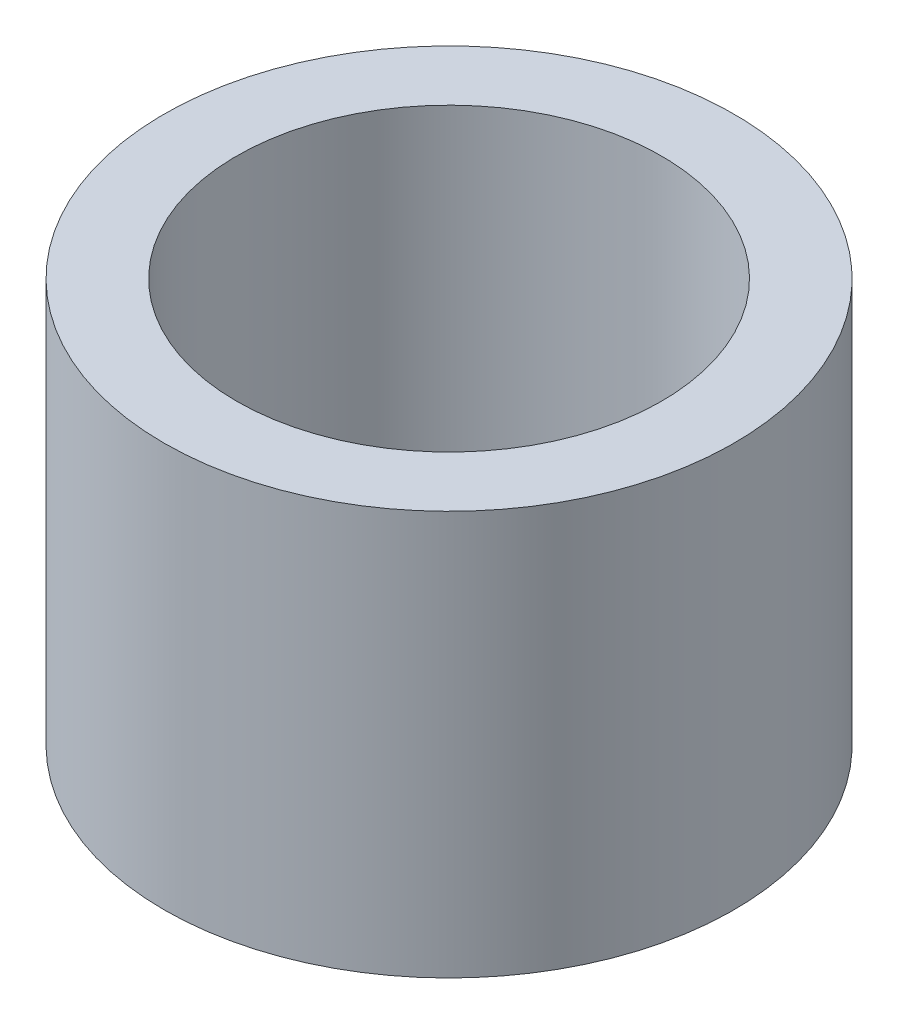
ISO-10303-21;
HEADER;
FILE_DESCRIPTION(('STEP AP214'),'2;1');
FILE_NAME('part.step','',(''),(''),'','','');
FILE_SCHEMA(('AUTOMOTIVE_DESIGN { 1 0 10303 214 1 1 1 1 }'));
ENDSEC;
DATA;
#1=APPLICATION_CONTEXT('core data for automotive mechanical design processes');
#2=APPLICATION_PROTOCOL_DEFINITION('international standard','automotive_design',2000,#1);
#3=PRODUCT_CONTEXT('',#1,'mechanical');
#4=PRODUCT('Part','Part','',(#3));
#5=PRODUCT_RELATED_PRODUCT_CATEGORY('part','',(#4));
#6=PRODUCT_DEFINITION_FORMATION('','',#4);
#7=PRODUCT_DEFINITION_CONTEXT('part definition',#1,'design');
#8=PRODUCT_DEFINITION('design','',#6,#7);
#9=PRODUCT_DEFINITION_SHAPE('','',#8);
#10=(LENGTH_UNIT() NAMED_UNIT(*) SI_UNIT(.MILLI.,.METRE.));
#11=(NAMED_UNIT(*) PLANE_ANGLE_UNIT() SI_UNIT($,.RADIAN.));
#12=(NAMED_UNIT(*) SI_UNIT($,.STERADIAN.) SOLID_ANGLE_UNIT());
#13=UNCERTAINTY_MEASURE_WITH_UNIT(LENGTH_MEASURE(1.E-05),#10,'distance_accuracy_value','');
#14=(GEOMETRIC_REPRESENTATION_CONTEXT(3) GLOBAL_UNCERTAINTY_ASSIGNED_CONTEXT((#13)) GLOBAL_UNIT_ASSIGNED_CONTEXT((#10,
#11,#12)) REPRESENTATION_CONTEXT('',''));
#15=CARTESIAN_POINT('',(0.,0.,0.));
#16=DIRECTION('',(0.,0.,1.));
#17=DIRECTION('',(1.,0.,0.));
#18=AXIS2_PLACEMENT_3D('',#15,#16,#17);
#19=CARTESIAN_POINT('',(0.,3.9,0.));
#20=DIRECTION('',(0.,1.,0.));
#21=DIRECTION('',(0.,0.,1.));
#22=AXIS2_PLACEMENT_3D('',#19,#20,#21);
#23=PLANE('',#22);
#24=CARTESIAN_POINT('',(0.,3.9,0.));
#25=DIRECTION('',(0.,1.,0.));
#26=DIRECTION('',(0.,0.,1.));
#27=AXIS2_PLACEMENT_3D('',#24,#25,#26);
#28=CIRCLE('',#27,5.5);
#29=CARTESIAN_POINT('',(0.,3.9,5.5));
#30=VERTEX_POINT('',#29);
#31=EDGE_CURVE('E10',#30,#30,#28,.T.);
#32=ORIENTED_EDGE('',*,*,#31,.T.);
#33=EDGE_LOOP('',(#32));
#34=FACE_BOUND('',#33,.T.);
#35=CARTESIAN_POINT('',(0.,3.9,0.));
#36=DIRECTION('',(0.,1.,0.));
#37=DIRECTION('',(0.,0.,1.));
#38=AXIS2_PLACEMENT_3D('',#35,#36,#37);
#39=CIRCLE('',#38,4.1);
#40=CARTESIAN_POINT('',(0.,3.9,4.1));
#41=VERTEX_POINT('',#40);
#42=EDGE_CURVE('E42',#41,#41,#39,.T.);
#43=ORIENTED_EDGE('',*,*,#42,.F.);
#44=EDGE_LOOP('',(#43));
#45=FACE_BOUND('',#44,.T.);
#46=ADVANCED_FACE('F31',(#34,#45),#23,.T.);
#47=CARTESIAN_POINT('',(0.,-3.9,0.));
#48=DIRECTION('',(0.,1.,0.));
#49=DIRECTION('',(0.,0.,1.));
#50=AXIS2_PLACEMENT_3D('',#47,#48,#49);
#51=PLANE('',#50);
#52=CARTESIAN_POINT('',(0.,-3.9,0.));
#53=DIRECTION('',(0.,1.,0.));
#54=DIRECTION('',(0.,0.,1.));
#55=AXIS2_PLACEMENT_3D('',#52,#53,#54);
#56=CIRCLE('',#55,5.5);
#57=CARTESIAN_POINT('',(0.,-3.9,5.5));
#58=VERTEX_POINT('',#57);
#59=EDGE_CURVE('E35',#58,#58,#56,.T.);
#60=ORIENTED_EDGE('',*,*,#59,.F.);
#61=EDGE_LOOP('',(#60));
#62=FACE_BOUND('',#61,.T.);
#63=CARTESIAN_POINT('',(0.,-3.9,0.));
#64=DIRECTION('',(0.,1.,0.));
#65=DIRECTION('',(0.,0.,1.));
#66=AXIS2_PLACEMENT_3D('',#63,#64,#65);
#67=CIRCLE('',#66,4.1);
#68=CARTESIAN_POINT('',(0.,-3.9,4.1));
#69=VERTEX_POINT('',#68);
#70=EDGE_CURVE('E44',#69,#69,#67,.T.);
#71=ORIENTED_EDGE('',*,*,#70,.T.);
#72=EDGE_LOOP('',(#71));
#73=FACE_BOUND('',#72,.T.);
#74=ADVANCED_FACE('F54',(#62,#73),#51,.F.);
#75=CARTESIAN_POINT('',(0.,3.9,0.));
#76=DIRECTION('',(0.,-1.,0.));
#77=DIRECTION('',(0.,0.,-1.));
#78=AXIS2_PLACEMENT_3D('',#75,#76,#77);
#79=CYLINDRICAL_SURFACE('',#78,5.5);
#80=ORIENTED_EDGE('',*,*,#31,.F.);
#81=EDGE_LOOP('',(#80));
#82=FACE_BOUND('',#81,.T.);
#83=ORIENTED_EDGE('',*,*,#59,.T.);
#84=EDGE_LOOP('',(#83));
#85=FACE_BOUND('',#84,.T.);
#86=ADVANCED_FACE('F33',(#82,#85),#79,.T.);
#87=CARTESIAN_POINT('',(0.,3.9,0.));
#88=DIRECTION('',(0.,-1.,0.));
#89=DIRECTION('',(0.,0.,-1.));
#90=AXIS2_PLACEMENT_3D('',#87,#88,#89);
#91=CYLINDRICAL_SURFACE('',#90,4.1);
#92=ORIENTED_EDGE('',*,*,#42,.T.);
#93=EDGE_LOOP('',(#92));
#94=FACE_BOUND('',#93,.T.);
#95=ORIENTED_EDGE('',*,*,#70,.F.);
#96=EDGE_LOOP('',(#95));
#97=FACE_BOUND('',#96,.T.);
#98=ADVANCED_FACE('F50',(#94,#97),#91,.F.);
#99=CLOSED_SHELL('',(#46,#74,#86,#98));
#100=MANIFOLD_SOLID_BREP('B2',#99);
#101=ADVANCED_BREP_SHAPE_REPRESENTATION('',(#18,#100),#14);
#102=SHAPE_DEFINITION_REPRESENTATION(#9,#101);
ENDSEC;
END-ISO-10303-21;
